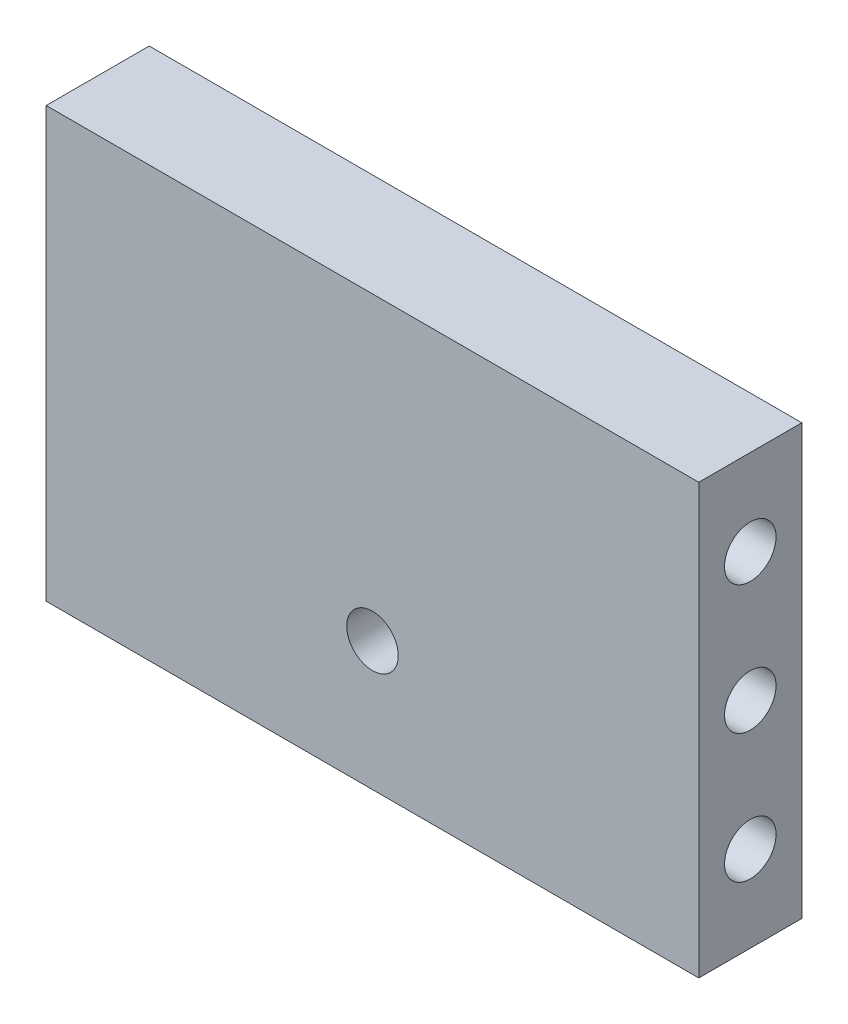
ISO-10303-21;
HEADER;
FILE_DESCRIPTION(('STEP AP214'),'2;1');
FILE_NAME('part.step','',(''),(''),'','','');
FILE_SCHEMA(('AUTOMOTIVE_DESIGN { 1 0 10303 214 1 1 1 1 }'));
ENDSEC;
DATA;
#1=APPLICATION_CONTEXT('core data for automotive mechanical design processes');
#2=APPLICATION_PROTOCOL_DEFINITION('international standard','automotive_design',2000,#1);
#3=PRODUCT_CONTEXT('',#1,'mechanical');
#4=PRODUCT('Part','Part','',(#3));
#5=PRODUCT_RELATED_PRODUCT_CATEGORY('part','',(#4));
#6=PRODUCT_DEFINITION_FORMATION('','',#4);
#7=PRODUCT_DEFINITION_CONTEXT('part definition',#1,'design');
#8=PRODUCT_DEFINITION('design','',#6,#7);
#9=PRODUCT_DEFINITION_SHAPE('','',#8);
#10=(LENGTH_UNIT() NAMED_UNIT(*) SI_UNIT(.MILLI.,.METRE.));
#11=(NAMED_UNIT(*) PLANE_ANGLE_UNIT() SI_UNIT($,.RADIAN.));
#12=(NAMED_UNIT(*) SI_UNIT($,.STERADIAN.) SOLID_ANGLE_UNIT());
#13=UNCERTAINTY_MEASURE_WITH_UNIT(LENGTH_MEASURE(1.E-05),#10,'distance_accuracy_value','');
#14=(GEOMETRIC_REPRESENTATION_CONTEXT(3) GLOBAL_UNCERTAINTY_ASSIGNED_CONTEXT((#13)) GLOBAL_UNIT_ASSIGNED_CONTEXT((#10,
#11,#12)) REPRESENTATION_CONTEXT('',''));
#15=CARTESIAN_POINT('',(0.,0.,0.));
#16=DIRECTION('',(0.,0.,1.));
#17=DIRECTION('',(1.,0.,0.));
#18=AXIS2_PLACEMENT_3D('',#15,#16,#17);
#19=CARTESIAN_POINT('',(38.,-25.,12.));
#20=DIRECTION('',(-1.,0.,0.));
#21=DIRECTION('',(0.,0.,1.));
#22=AXIS2_PLACEMENT_3D('',#19,#20,#21);
#23=PLANE('',#22);
#24=CARTESIAN_POINT('',(38.,-15.,6.));
#25=DIRECTION('',(1.,0.,0.));
#26=DIRECTION('',(0.,0.,-1.));
#27=AXIS2_PLACEMENT_3D('',#24,#25,#26);
#28=CIRCLE('',#27,3.);
#29=CARTESIAN_POINT('',(38.,-15.,3.));
#30=VERTEX_POINT('',#29);
#31=EDGE_CURVE('E140',#30,#30,#28,.T.);
#32=ORIENTED_EDGE('',*,*,#31,.F.);
#33=EDGE_LOOP('',(#32));
#34=FACE_BOUND('',#33,.T.);
#35=CARTESIAN_POINT('',(38.,0.,6.00000000000005));
#36=DIRECTION('',(1.,0.,0.));
#37=DIRECTION('',(0.,0.,-1.));
#38=AXIS2_PLACEMENT_3D('',#35,#36,#37);
#39=CIRCLE('',#38,3.);
#40=CARTESIAN_POINT('',(38.,0.,3.00000000000005));
#41=VERTEX_POINT('',#40);
#42=EDGE_CURVE('E134',#41,#41,#39,.T.);
#43=ORIENTED_EDGE('',*,*,#42,.F.);
#44=EDGE_LOOP('',(#43));
#45=FACE_BOUND('',#44,.T.);
#46=CARTESIAN_POINT('',(38.,15.,6.0000000000001));
#47=DIRECTION('',(1.,0.,0.));
#48=DIRECTION('',(0.,0.,-1.));
#49=AXIS2_PLACEMENT_3D('',#46,#47,#48);
#50=CIRCLE('',#49,3.);
#51=CARTESIAN_POINT('',(38.,15.,3.0000000000001));
#52=VERTEX_POINT('',#51);
#53=EDGE_CURVE('E127',#52,#52,#50,.T.);
#54=ORIENTED_EDGE('',*,*,#53,.F.);
#55=EDGE_LOOP('',(#54));
#56=FACE_BOUND('',#55,.T.);
#57=DIRECTION('',(0.,1.,0.));
#58=VECTOR('',#57,1.);
#59=CARTESIAN_POINT('',(38.,-25.,0.));
#60=LINE('',#59,#58);
#61=CARTESIAN_POINT('',(38.,-25.,0.));
#62=VERTEX_POINT('',#61);
#63=CARTESIAN_POINT('',(38.,25.,0.));
#64=VERTEX_POINT('',#63);
#65=EDGE_CURVE('E95',#62,#64,#60,.T.);
#66=ORIENTED_EDGE('',*,*,#65,.T.);
#67=DIRECTION('',(0.,0.,-1.));
#68=VECTOR('',#67,1.);
#69=CARTESIAN_POINT('',(38.,25.,12.));
#70=LINE('',#69,#68);
#71=CARTESIAN_POINT('',(38.,25.,12.));
#72=VERTEX_POINT('',#71);
#73=EDGE_CURVE('E11',#72,#64,#70,.T.);
#74=ORIENTED_EDGE('',*,*,#73,.F.);
#75=DIRECTION('',(0.,1.,0.));
#76=VECTOR('',#75,1.);
#77=CARTESIAN_POINT('',(38.,-25.,12.));
#78=LINE('',#77,#76);
#79=CARTESIAN_POINT('',(38.,-25.,12.));
#80=VERTEX_POINT('',#79);
#81=EDGE_CURVE('E83',#80,#72,#78,.T.);
#82=ORIENTED_EDGE('',*,*,#81,.F.);
#83=DIRECTION('',(0.,0.,-1.));
#84=VECTOR('',#83,1.);
#85=CARTESIAN_POINT('',(38.,-25.,12.));
#86=LINE('',#85,#84);
#87=EDGE_CURVE('E91',#80,#62,#86,.T.);
#88=ORIENTED_EDGE('',*,*,#87,.T.);
#89=EDGE_LOOP('',(#66,#74,#82,#88));
#90=FACE_BOUND('',#89,.T.);
#91=ADVANCED_FACE('F32',(#34,#45,#56,#90),#23,.F.);
#92=CARTESIAN_POINT('',(-38.,25.,12.));
#93=DIRECTION('',(0.,-1.,0.));
#94=DIRECTION('',(0.,0.,-1.));
#95=AXIS2_PLACEMENT_3D('',#92,#93,#94);
#96=PLANE('',#95);
#97=DIRECTION('',(-1.,0.,0.));
#98=VECTOR('',#97,1.);
#99=CARTESIAN_POINT('',(-38.,25.,0.));
#100=LINE('',#99,#98);
#101=CARTESIAN_POINT('',(-38.,25.,0.));
#102=VERTEX_POINT('',#101);
#103=EDGE_CURVE('E87',#64,#102,#100,.T.);
#104=ORIENTED_EDGE('',*,*,#103,.T.);
#105=DIRECTION('',(0.,0.,-1.));
#106=VECTOR('',#105,1.);
#107=CARTESIAN_POINT('',(-38.,25.,12.));
#108=LINE('',#107,#106);
#109=CARTESIAN_POINT('',(-38.,25.,12.));
#110=VERTEX_POINT('',#109);
#111=EDGE_CURVE('E40',#110,#102,#108,.T.);
#112=ORIENTED_EDGE('',*,*,#111,.F.);
#113=DIRECTION('',(-1.,0.,0.));
#114=VECTOR('',#113,1.);
#115=CARTESIAN_POINT('',(-38.,25.,12.));
#116=LINE('',#115,#114);
#117=EDGE_CURVE('E78',#72,#110,#116,.T.);
#118=ORIENTED_EDGE('',*,*,#117,.F.);
#119=ORIENTED_EDGE('',*,*,#73,.T.);
#120=EDGE_LOOP('',(#104,#112,#118,#119));
#121=FACE_BOUND('',#120,.T.);
#122=ADVANCED_FACE('F86',(#121),#96,.F.);
#123=CARTESIAN_POINT('',(-38.,-25.,12.));
#124=DIRECTION('',(1.,0.,0.));
#125=DIRECTION('',(0.,0.,-1.));
#126=AXIS2_PLACEMENT_3D('',#123,#124,#125);
#127=PLANE('',#126);
#128=CARTESIAN_POINT('',(-38.,-15.,6.));
#129=DIRECTION('',(-1.,0.,0.));
#130=DIRECTION('',(0.,0.,1.));
#131=AXIS2_PLACEMENT_3D('',#128,#129,#130);
#132=CIRCLE('',#131,3.);
#133=CARTESIAN_POINT('',(-38.,-15.,9.));
#134=VERTEX_POINT('',#133);
#135=EDGE_CURVE('E122',#134,#134,#132,.T.);
#136=ORIENTED_EDGE('',*,*,#135,.F.);
#137=EDGE_LOOP('',(#136));
#138=FACE_BOUND('',#137,.T.);
#139=CARTESIAN_POINT('',(-38.,0.,5.99999999999995));
#140=DIRECTION('',(-1.,0.,0.));
#141=DIRECTION('',(0.,0.,1.));
#142=AXIS2_PLACEMENT_3D('',#139,#140,#141);
#143=CIRCLE('',#142,3.);
#144=CARTESIAN_POINT('',(-38.,0.,8.99999999999995));
#145=VERTEX_POINT('',#144);
#146=EDGE_CURVE('E116',#145,#145,#143,.T.);
#147=ORIENTED_EDGE('',*,*,#146,.F.);
#148=EDGE_LOOP('',(#147));
#149=FACE_BOUND('',#148,.T.);
#150=CARTESIAN_POINT('',(-38.,15.,5.9999999999999));
#151=DIRECTION('',(-1.,0.,0.));
#152=DIRECTION('',(0.,0.,1.));
#153=AXIS2_PLACEMENT_3D('',#150,#151,#152);
#154=CIRCLE('',#153,3.);
#155=CARTESIAN_POINT('',(-38.,15.,8.9999999999999));
#156=VERTEX_POINT('',#155);
#157=EDGE_CURVE('E109',#156,#156,#154,.T.);
#158=ORIENTED_EDGE('',*,*,#157,.F.);
#159=EDGE_LOOP('',(#158));
#160=FACE_BOUND('',#159,.T.);
#161=DIRECTION('',(0.,-1.,0.));
#162=VECTOR('',#161,1.);
#163=CARTESIAN_POINT('',(-38.,-25.,0.));
#164=LINE('',#163,#162);
#165=CARTESIAN_POINT('',(-38.,-25.,0.));
#166=VERTEX_POINT('',#165);
#167=EDGE_CURVE('E65',#102,#166,#164,.T.);
#168=ORIENTED_EDGE('',*,*,#167,.T.);
#169=DIRECTION('',(0.,0.,-1.));
#170=VECTOR('',#169,1.);
#171=CARTESIAN_POINT('',(-38.,-25.,12.));
#172=LINE('',#171,#170);
#173=CARTESIAN_POINT('',(-38.,-25.,12.));
#174=VERTEX_POINT('',#173);
#175=EDGE_CURVE('E88',#174,#166,#172,.T.);
#176=ORIENTED_EDGE('',*,*,#175,.F.);
#177=DIRECTION('',(0.,-1.,0.));
#178=VECTOR('',#177,1.);
#179=CARTESIAN_POINT('',(-38.,-25.,12.));
#180=LINE('',#179,#178);
#181=EDGE_CURVE('E81',#110,#174,#180,.T.);
#182=ORIENTED_EDGE('',*,*,#181,.F.);
#183=ORIENTED_EDGE('',*,*,#111,.T.);
#184=EDGE_LOOP('',(#168,#176,#182,#183));
#185=FACE_BOUND('',#184,.T.);
#186=ADVANCED_FACE('F89',(#138,#149,#160,#185),#127,.F.);
#187=CARTESIAN_POINT('',(-38.,-25.,12.));
#188=DIRECTION('',(0.,1.,0.));
#189=DIRECTION('',(0.,0.,1.));
#190=AXIS2_PLACEMENT_3D('',#187,#188,#189);
#191=PLANE('',#190);
#192=CARTESIAN_POINT('',(22.5,-25.,6.));
#193=DIRECTION('',(0.,-1.,0.));
#194=DIRECTION('',(0.,0.,-1.));
#195=AXIS2_PLACEMENT_3D('',#192,#193,#194);
#196=CIRCLE('',#195,3.);
#197=CARTESIAN_POINT('',(22.5,-25.,3.));
#198=VERTEX_POINT('',#197);
#199=EDGE_CURVE('E164',#198,#198,#196,.T.);
#200=ORIENTED_EDGE('',*,*,#199,.F.);
#201=EDGE_LOOP('',(#200));
#202=FACE_BOUND('',#201,.T.);
#203=CARTESIAN_POINT('',(7.49999999999997,-25.,5.9999999999999));
#204=DIRECTION('',(0.,-1.,0.));
#205=DIRECTION('',(0.,0.,-1.));
#206=AXIS2_PLACEMENT_3D('',#203,#204,#205);
#207=CIRCLE('',#206,3.);
#208=CARTESIAN_POINT('',(7.49999999999997,-25.,2.99999999999989));
#209=VERTEX_POINT('',#208);
#210=EDGE_CURVE('E158',#209,#209,#207,.T.);
#211=ORIENTED_EDGE('',*,*,#210,.F.);
#212=EDGE_LOOP('',(#211));
#213=FACE_BOUND('',#212,.T.);
#214=CARTESIAN_POINT('',(-7.50000000000003,-25.,5.99999999999979));
#215=DIRECTION('',(0.,-1.,0.));
#216=DIRECTION('',(0.,0.,-1.));
#217=AXIS2_PLACEMENT_3D('',#214,#215,#216);
#218=CIRCLE('',#217,3.);
#219=CARTESIAN_POINT('',(-7.50000000000003,-25.,2.99999999999979));
#220=VERTEX_POINT('',#219);
#221=EDGE_CURVE('E152',#220,#220,#218,.T.);
#222=ORIENTED_EDGE('',*,*,#221,.F.);
#223=EDGE_LOOP('',(#222));
#224=FACE_BOUND('',#223,.T.);
#225=CARTESIAN_POINT('',(-22.5,-25.,5.99999999999969));
#226=DIRECTION('',(0.,-1.,0.));
#227=DIRECTION('',(0.,0.,-1.));
#228=AXIS2_PLACEMENT_3D('',#225,#226,#227);
#229=CIRCLE('',#228,3.);
#230=CARTESIAN_POINT('',(-22.5,-25.,2.99999999999969));
#231=VERTEX_POINT('',#230);
#232=EDGE_CURVE('E145',#231,#231,#229,.T.);
#233=ORIENTED_EDGE('',*,*,#232,.F.);
#234=EDGE_LOOP('',(#233));
#235=FACE_BOUND('',#234,.T.);
#236=DIRECTION('',(1.,0.,0.));
#237=VECTOR('',#236,1.);
#238=CARTESIAN_POINT('',(-38.,-25.,0.));
#239=LINE('',#238,#237);
#240=EDGE_CURVE('E71',#166,#62,#239,.T.);
#241=ORIENTED_EDGE('',*,*,#240,.T.);
#242=ORIENTED_EDGE('',*,*,#87,.F.);
#243=DIRECTION('',(1.,0.,0.));
#244=VECTOR('',#243,1.);
#245=CARTESIAN_POINT('',(-38.,-25.,12.));
#246=LINE('',#245,#244);
#247=EDGE_CURVE('E48',#174,#80,#246,.T.);
#248=ORIENTED_EDGE('',*,*,#247,.F.);
#249=ORIENTED_EDGE('',*,*,#175,.T.);
#250=EDGE_LOOP('',(#241,#242,#248,#249));
#251=FACE_BOUND('',#250,.T.);
#252=ADVANCED_FACE('F103',(#202,#213,#224,#235,#251),#191,.F.);
#253=CARTESIAN_POINT('',(0.,0.,12.));
#254=DIRECTION('',(0.,0.,-1.));
#255=DIRECTION('',(-1.,0.,0.));
#256=AXIS2_PLACEMENT_3D('',#253,#254,#255);
#257=PLANE('',#256);
#258=CARTESIAN_POINT('',(0.,-10.,12.));
#259=DIRECTION('',(0.,0.,-1.));
#260=DIRECTION('',(-1.,0.,0.));
#261=AXIS2_PLACEMENT_3D('',#258,#259,#260);
#262=CIRCLE('',#261,3.);
#263=CARTESIAN_POINT('',(-3.,-10.,12.));
#264=VERTEX_POINT('',#263);
#265=EDGE_CURVE('E149',#264,#264,#262,.T.);
#266=ORIENTED_EDGE('',*,*,#265,.T.);
#267=EDGE_LOOP('',(#266));
#268=FACE_BOUND('',#267,.T.);
#269=ORIENTED_EDGE('',*,*,#81,.T.);
#270=ORIENTED_EDGE('',*,*,#117,.T.);
#271=ORIENTED_EDGE('',*,*,#181,.T.);
#272=ORIENTED_EDGE('',*,*,#247,.T.);
#273=EDGE_LOOP('',(#269,#270,#271,#272));
#274=FACE_BOUND('',#273,.T.);
#275=ADVANCED_FACE('F79',(#268,#274),#257,.F.);
#276=CARTESIAN_POINT('',(0.,0.,0.));
#277=DIRECTION('',(0.,0.,-1.));
#278=DIRECTION('',(-1.,0.,0.));
#279=AXIS2_PLACEMENT_3D('',#276,#277,#278);
#280=PLANE('',#279);
#281=CARTESIAN_POINT('',(0.,-10.,0.));
#282=DIRECTION('',(0.,0.,-1.));
#283=DIRECTION('',(-1.,0.,0.));
#284=AXIS2_PLACEMENT_3D('',#281,#282,#283);
#285=CIRCLE('',#284,3.);
#286=CARTESIAN_POINT('',(-3.,-10.,0.));
#287=VERTEX_POINT('',#286);
#288=EDGE_CURVE('E169',#287,#287,#285,.T.);
#289=ORIENTED_EDGE('',*,*,#288,.F.);
#290=EDGE_LOOP('',(#289));
#291=FACE_BOUND('',#290,.T.);
#292=ORIENTED_EDGE('',*,*,#65,.F.);
#293=ORIENTED_EDGE('',*,*,#240,.F.);
#294=ORIENTED_EDGE('',*,*,#167,.F.);
#295=ORIENTED_EDGE('',*,*,#103,.F.);
#296=EDGE_LOOP('',(#292,#293,#294,#295));
#297=FACE_BOUND('',#296,.T.);
#298=ADVANCED_FACE('F106',(#291,#297),#280,.T.);
#299=CARTESIAN_POINT('',(-28.,15.,5.9999999999999));
#300=DIRECTION('',(-1.,0.,0.));
#301=DIRECTION('',(0.,0.,1.));
#302=AXIS2_PLACEMENT_3D('',#299,#300,#301);
#303=CYLINDRICAL_SURFACE('',#302,3.);
#304=CARTESIAN_POINT('',(-28.,15.,5.9999999999999));
#305=DIRECTION('',(-1.,0.,0.));
#306=DIRECTION('',(0.,0.,1.));
#307=AXIS2_PLACEMENT_3D('',#304,#305,#306);
#308=CIRCLE('',#307,3.);
#309=CARTESIAN_POINT('',(-28.,15.,8.9999999999999));
#310=VERTEX_POINT('',#309);
#311=EDGE_CURVE('E112',#310,#310,#308,.T.);
#312=ORIENTED_EDGE('',*,*,#311,.F.);
#313=EDGE_LOOP('',(#312));
#314=FACE_BOUND('',#313,.T.);
#315=ORIENTED_EDGE('',*,*,#157,.T.);
#316=EDGE_LOOP('',(#315));
#317=FACE_BOUND('',#316,.T.);
#318=ADVANCED_FACE('F184',(#314,#317),#303,.F.);
#319=CARTESIAN_POINT('',(-28.,15.,5.9999999999999));
#320=DIRECTION('',(-1.,0.,0.));
#321=DIRECTION('',(0.,0.,1.));
#322=AXIS2_PLACEMENT_3D('',#319,#320,#321);
#323=PLANE('',#322);
#324=ORIENTED_EDGE('',*,*,#311,.T.);
#325=EDGE_LOOP('',(#324));
#326=FACE_BOUND('',#325,.T.);
#327=ADVANCED_FACE('F191',(#326),#323,.T.);
#328=CARTESIAN_POINT('',(-28.,0.,5.99999999999995));
#329=DIRECTION('',(-1.,0.,0.));
#330=DIRECTION('',(0.,0.,1.));
#331=AXIS2_PLACEMENT_3D('',#328,#329,#330);
#332=CYLINDRICAL_SURFACE('',#331,3.);
#333=CARTESIAN_POINT('',(-28.,0.,5.99999999999995));
#334=DIRECTION('',(-1.,0.,0.));
#335=DIRECTION('',(0.,0.,1.));
#336=AXIS2_PLACEMENT_3D('',#333,#334,#335);
#337=CIRCLE('',#336,3.);
#338=CARTESIAN_POINT('',(-28.,0.,8.99999999999995));
#339=VERTEX_POINT('',#338);
#340=EDGE_CURVE('E119',#339,#339,#337,.T.);
#341=ORIENTED_EDGE('',*,*,#340,.F.);
#342=EDGE_LOOP('',(#341));
#343=FACE_BOUND('',#342,.T.);
#344=ORIENTED_EDGE('',*,*,#146,.T.);
#345=EDGE_LOOP('',(#344));
#346=FACE_BOUND('',#345,.T.);
#347=ADVANCED_FACE('F232',(#343,#346),#332,.F.);
#348=CARTESIAN_POINT('',(-28.,0.,5.99999999999995));
#349=DIRECTION('',(-1.,0.,0.));
#350=DIRECTION('',(0.,0.,1.));
#351=AXIS2_PLACEMENT_3D('',#348,#349,#350);
#352=PLANE('',#351);
#353=ORIENTED_EDGE('',*,*,#340,.T.);
#354=EDGE_LOOP('',(#353));
#355=FACE_BOUND('',#354,.T.);
#356=ADVANCED_FACE('F228',(#355),#352,.T.);
#357=CARTESIAN_POINT('',(-28.,-15.,6.));
#358=DIRECTION('',(-1.,0.,0.));
#359=DIRECTION('',(0.,0.,1.));
#360=AXIS2_PLACEMENT_3D('',#357,#358,#359);
#361=CYLINDRICAL_SURFACE('',#360,3.);
#362=CARTESIAN_POINT('',(-28.,-15.,6.));
#363=DIRECTION('',(-1.,0.,0.));
#364=DIRECTION('',(0.,0.,1.));
#365=AXIS2_PLACEMENT_3D('',#362,#363,#364);
#366=CIRCLE('',#365,3.);
#367=CARTESIAN_POINT('',(-28.,-15.,9.));
#368=VERTEX_POINT('',#367);
#369=EDGE_CURVE('E98',#368,#368,#366,.T.);
#370=ORIENTED_EDGE('',*,*,#369,.F.);
#371=EDGE_LOOP('',(#370));
#372=FACE_BOUND('',#371,.T.);
#373=ORIENTED_EDGE('',*,*,#135,.T.);
#374=EDGE_LOOP('',(#373));
#375=FACE_BOUND('',#374,.T.);
#376=ADVANCED_FACE('F220',(#372,#375),#361,.F.);
#377=CARTESIAN_POINT('',(-28.,-15.,6.));
#378=DIRECTION('',(-1.,0.,0.));
#379=DIRECTION('',(0.,0.,1.));
#380=AXIS2_PLACEMENT_3D('',#377,#378,#379);
#381=PLANE('',#380);
#382=ORIENTED_EDGE('',*,*,#369,.T.);
#383=EDGE_LOOP('',(#382));
#384=FACE_BOUND('',#383,.T.);
#385=ADVANCED_FACE('F210',(#384),#381,.T.);
#386=CARTESIAN_POINT('',(28.,15.,6.0000000000001));
#387=DIRECTION('',(1.,0.,0.));
#388=DIRECTION('',(0.,0.,-1.));
#389=AXIS2_PLACEMENT_3D('',#386,#387,#388);
#390=CYLINDRICAL_SURFACE('',#389,3.);
#391=CARTESIAN_POINT('',(28.,15.,6.0000000000001));
#392=DIRECTION('',(1.,0.,0.));
#393=DIRECTION('',(0.,0.,-1.));
#394=AXIS2_PLACEMENT_3D('',#391,#392,#393);
#395=CIRCLE('',#394,3.);
#396=CARTESIAN_POINT('',(28.,15.,3.0000000000001));
#397=VERTEX_POINT('',#396);
#398=EDGE_CURVE('E130',#397,#397,#395,.T.);
#399=ORIENTED_EDGE('',*,*,#398,.F.);
#400=EDGE_LOOP('',(#399));
#401=FACE_BOUND('',#400,.T.);
#402=ORIENTED_EDGE('',*,*,#53,.T.);
#403=EDGE_LOOP('',(#402));
#404=FACE_BOUND('',#403,.T.);
#405=ADVANCED_FACE('F207',(#401,#404),#390,.F.);
#406=CARTESIAN_POINT('',(28.,15.,6.0000000000001));
#407=DIRECTION('',(1.,0.,0.));
#408=DIRECTION('',(0.,0.,-1.));
#409=AXIS2_PLACEMENT_3D('',#406,#407,#408);
#410=PLANE('',#409);
#411=ORIENTED_EDGE('',*,*,#398,.T.);
#412=EDGE_LOOP('',(#411));
#413=FACE_BOUND('',#412,.T.);
#414=ADVANCED_FACE('F209',(#413),#410,.T.);
#415=CARTESIAN_POINT('',(28.,0.,6.00000000000005));
#416=DIRECTION('',(1.,0.,0.));
#417=DIRECTION('',(0.,0.,-1.));
#418=AXIS2_PLACEMENT_3D('',#415,#416,#417);
#419=CYLINDRICAL_SURFACE('',#418,3.);
#420=CARTESIAN_POINT('',(28.,0.,6.00000000000005));
#421=DIRECTION('',(1.,0.,0.));
#422=DIRECTION('',(0.,0.,-1.));
#423=AXIS2_PLACEMENT_3D('',#420,#421,#422);
#424=CIRCLE('',#423,3.);
#425=CARTESIAN_POINT('',(28.,0.,3.00000000000005));
#426=VERTEX_POINT('',#425);
#427=EDGE_CURVE('E137',#426,#426,#424,.T.);
#428=ORIENTED_EDGE('',*,*,#427,.F.);
#429=EDGE_LOOP('',(#428));
#430=FACE_BOUND('',#429,.T.);
#431=ORIENTED_EDGE('',*,*,#42,.T.);
#432=EDGE_LOOP('',(#431));
#433=FACE_BOUND('',#432,.T.);
#434=ADVANCED_FACE('F217',(#430,#433),#419,.F.);
#435=CARTESIAN_POINT('',(28.,0.,6.00000000000005));
#436=DIRECTION('',(1.,0.,0.));
#437=DIRECTION('',(0.,0.,-1.));
#438=AXIS2_PLACEMENT_3D('',#435,#436,#437);
#439=PLANE('',#438);
#440=ORIENTED_EDGE('',*,*,#427,.T.);
#441=EDGE_LOOP('',(#440));
#442=FACE_BOUND('',#441,.T.);
#443=ADVANCED_FACE('F289',(#442),#439,.T.);
#444=CARTESIAN_POINT('',(28.,-15.,6.));
#445=DIRECTION('',(1.,0.,0.));
#446=DIRECTION('',(0.,0.,-1.));
#447=AXIS2_PLACEMENT_3D('',#444,#445,#446);
#448=CYLINDRICAL_SURFACE('',#447,3.);
#449=CARTESIAN_POINT('',(28.,-15.,6.));
#450=DIRECTION('',(1.,0.,0.));
#451=DIRECTION('',(0.,0.,-1.));
#452=AXIS2_PLACEMENT_3D('',#449,#450,#451);
#453=CIRCLE('',#452,3.);
#454=CARTESIAN_POINT('',(28.,-15.,3.));
#455=VERTEX_POINT('',#454);
#456=EDGE_CURVE('E113',#455,#455,#453,.T.);
#457=ORIENTED_EDGE('',*,*,#456,.F.);
#458=EDGE_LOOP('',(#457));
#459=FACE_BOUND('',#458,.T.);
#460=ORIENTED_EDGE('',*,*,#31,.T.);
#461=EDGE_LOOP('',(#460));
#462=FACE_BOUND('',#461,.T.);
#463=ADVANCED_FACE('F281',(#459,#462),#448,.F.);
#464=CARTESIAN_POINT('',(28.,-15.,6.));
#465=DIRECTION('',(1.,0.,0.));
#466=DIRECTION('',(0.,0.,-1.));
#467=AXIS2_PLACEMENT_3D('',#464,#465,#466);
#468=PLANE('',#467);
#469=ORIENTED_EDGE('',*,*,#456,.T.);
#470=EDGE_LOOP('',(#469));
#471=FACE_BOUND('',#470,.T.);
#472=ADVANCED_FACE('F272',(#471),#468,.T.);
#473=CARTESIAN_POINT('',(-22.5,-15.,5.99999999999969));
#474=DIRECTION('',(0.,-1.,0.));
#475=DIRECTION('',(0.,0.,-1.));
#476=AXIS2_PLACEMENT_3D('',#473,#474,#475);
#477=CYLINDRICAL_SURFACE('',#476,3.);
#478=CARTESIAN_POINT('',(-22.5,-15.,5.99999999999969));
#479=DIRECTION('',(0.,-1.,0.));
#480=DIRECTION('',(0.,0.,-1.));
#481=AXIS2_PLACEMENT_3D('',#478,#479,#480);
#482=CIRCLE('',#481,3.);
#483=CARTESIAN_POINT('',(-22.5,-15.,2.99999999999969));
#484=VERTEX_POINT('',#483);
#485=EDGE_CURVE('E148',#484,#484,#482,.T.);
#486=ORIENTED_EDGE('',*,*,#485,.F.);
#487=EDGE_LOOP('',(#486));
#488=FACE_BOUND('',#487,.T.);
#489=ORIENTED_EDGE('',*,*,#232,.T.);
#490=EDGE_LOOP('',(#489));
#491=FACE_BOUND('',#490,.T.);
#492=ADVANCED_FACE('F269',(#488,#491),#477,.F.);
#493=CARTESIAN_POINT('',(-22.5,-15.,5.99999999999969));
#494=DIRECTION('',(0.,-1.,0.));
#495=DIRECTION('',(0.,0.,-1.));
#496=AXIS2_PLACEMENT_3D('',#493,#494,#495);
#497=PLANE('',#496);
#498=ORIENTED_EDGE('',*,*,#485,.T.);
#499=EDGE_LOOP('',(#498));
#500=FACE_BOUND('',#499,.T.);
#501=ADVANCED_FACE('F271',(#500),#497,.T.);
#502=CARTESIAN_POINT('',(-7.50000000000003,-15.,5.99999999999979));
#503=DIRECTION('',(0.,-1.,0.));
#504=DIRECTION('',(0.,0.,-1.));
#505=AXIS2_PLACEMENT_3D('',#502,#503,#504);
#506=CYLINDRICAL_SURFACE('',#505,3.);
#507=CARTESIAN_POINT('',(-7.50000000000003,-15.,5.99999999999979));
#508=DIRECTION('',(0.,-1.,0.));
#509=DIRECTION('',(0.,0.,-1.));
#510=AXIS2_PLACEMENT_3D('',#507,#508,#509);
#511=CIRCLE('',#510,3.);
#512=CARTESIAN_POINT('',(-7.50000000000003,-15.,2.99999999999979));
#513=VERTEX_POINT('',#512);
#514=EDGE_CURVE('E155',#513,#513,#511,.T.);
#515=ORIENTED_EDGE('',*,*,#514,.F.);
#516=EDGE_LOOP('',(#515));
#517=FACE_BOUND('',#516,.T.);
#518=ORIENTED_EDGE('',*,*,#221,.T.);
#519=EDGE_LOOP('',(#518));
#520=FACE_BOUND('',#519,.T.);
#521=ADVANCED_FACE('F278',(#517,#520),#506,.F.);
#522=CARTESIAN_POINT('',(-7.50000000000003,-15.,5.99999999999979));
#523=DIRECTION('',(0.,-1.,0.));
#524=DIRECTION('',(0.,0.,-1.));
#525=AXIS2_PLACEMENT_3D('',#522,#523,#524);
#526=PLANE('',#525);
#527=ORIENTED_EDGE('',*,*,#514,.T.);
#528=EDGE_LOOP('',(#527));
#529=FACE_BOUND('',#528,.T.);
#530=ADVANCED_FACE('F333',(#529),#526,.T.);
#531=CARTESIAN_POINT('',(7.49999999999997,-15.,5.9999999999999));
#532=DIRECTION('',(0.,-1.,0.));
#533=DIRECTION('',(0.,0.,-1.));
#534=AXIS2_PLACEMENT_3D('',#531,#532,#533);
#535=CYLINDRICAL_SURFACE('',#534,3.);
#536=CARTESIAN_POINT('',(7.49999999999997,-15.,5.9999999999999));
#537=DIRECTION('',(0.,-1.,0.));
#538=DIRECTION('',(0.,0.,-1.));
#539=AXIS2_PLACEMENT_3D('',#536,#537,#538);
#540=CIRCLE('',#539,3.);
#541=CARTESIAN_POINT('',(7.49999999999997,-15.,2.99999999999989));
#542=VERTEX_POINT('',#541);
#543=EDGE_CURVE('E161',#542,#542,#540,.T.);
#544=ORIENTED_EDGE('',*,*,#543,.F.);
#545=EDGE_LOOP('',(#544));
#546=FACE_BOUND('',#545,.T.);
#547=ORIENTED_EDGE('',*,*,#210,.T.);
#548=EDGE_LOOP('',(#547));
#549=FACE_BOUND('',#548,.T.);
#550=ADVANCED_FACE('F341',(#546,#549),#535,.F.);
#551=CARTESIAN_POINT('',(7.49999999999997,-15.,5.9999999999999));
#552=DIRECTION('',(0.,-1.,0.));
#553=DIRECTION('',(0.,0.,-1.));
#554=AXIS2_PLACEMENT_3D('',#551,#552,#553);
#555=PLANE('',#554);
#556=ORIENTED_EDGE('',*,*,#543,.T.);
#557=EDGE_LOOP('',(#556));
#558=FACE_BOUND('',#557,.T.);
#559=ADVANCED_FACE('F350',(#558),#555,.T.);
#560=CARTESIAN_POINT('',(22.5,-15.,6.));
#561=DIRECTION('',(0.,-1.,0.));
#562=DIRECTION('',(0.,0.,-1.));
#563=AXIS2_PLACEMENT_3D('',#560,#561,#562);
#564=CYLINDRICAL_SURFACE('',#563,3.);
#565=CARTESIAN_POINT('',(22.5,-15.,6.));
#566=DIRECTION('',(0.,-1.,0.));
#567=DIRECTION('',(0.,0.,-1.));
#568=AXIS2_PLACEMENT_3D('',#565,#566,#567);
#569=CIRCLE('',#568,3.);
#570=CARTESIAN_POINT('',(22.5,-15.,3.));
#571=VERTEX_POINT('',#570);
#572=EDGE_CURVE('E131',#571,#571,#569,.T.);
#573=ORIENTED_EDGE('',*,*,#572,.F.);
#574=EDGE_LOOP('',(#573));
#575=FACE_BOUND('',#574,.T.);
#576=ORIENTED_EDGE('',*,*,#199,.T.);
#577=EDGE_LOOP('',(#576));
#578=FACE_BOUND('',#577,.T.);
#579=ADVANCED_FACE('F359',(#575,#578),#564,.F.);
#580=CARTESIAN_POINT('',(22.5,-15.,6.));
#581=DIRECTION('',(0.,-1.,0.));
#582=DIRECTION('',(0.,0.,-1.));
#583=AXIS2_PLACEMENT_3D('',#580,#581,#582);
#584=PLANE('',#583);
#585=ORIENTED_EDGE('',*,*,#572,.T.);
#586=EDGE_LOOP('',(#585));
#587=FACE_BOUND('',#586,.T.);
#588=ADVANCED_FACE('F179',(#587),#584,.T.);
#589=CARTESIAN_POINT('',(0.,-10.,12.));
#590=DIRECTION('',(0.,0.,-1.));
#591=DIRECTION('',(-1.,0.,0.));
#592=AXIS2_PLACEMENT_3D('',#589,#590,#591);
#593=CYLINDRICAL_SURFACE('',#592,3.);
#594=ORIENTED_EDGE('',*,*,#265,.F.);
#595=EDGE_LOOP('',(#594));
#596=FACE_BOUND('',#595,.T.);
#597=ORIENTED_EDGE('',*,*,#288,.T.);
#598=EDGE_LOOP('',(#597));
#599=FACE_BOUND('',#598,.T.);
#600=ADVANCED_FACE('F176',(#596,#599),#593,.F.);
#601=CLOSED_SHELL('',(#91,#122,#186,#252,#275,#298,#318,#327,#347,#356,#376,#385,#405,#414,#434,
#443,#463,#472,#492,#501,#521,#530,#550,#559,#579,#588,#600));
#602=MANIFOLD_SOLID_BREP('B2',#601);
#603=ADVANCED_BREP_SHAPE_REPRESENTATION('',(#18,#602),#14);
#604=SHAPE_DEFINITION_REPRESENTATION(#9,#603);
ENDSEC;
END-ISO-10303-21;
